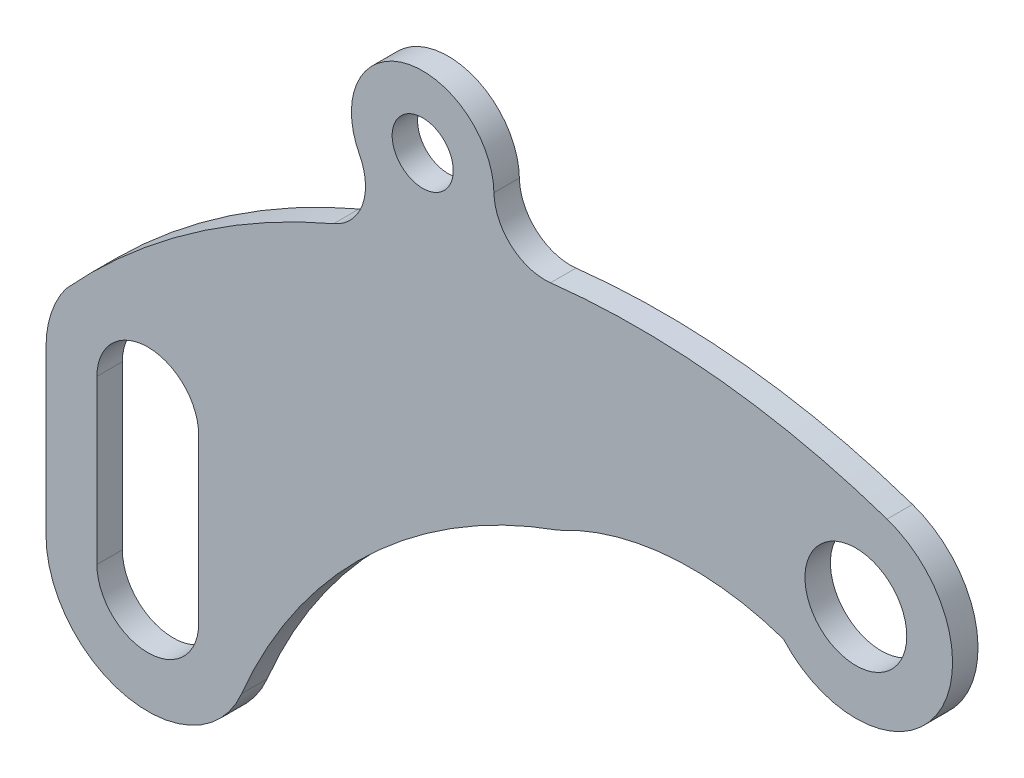
ISO-10303-21;
HEADER;
FILE_DESCRIPTION(('STEP AP214'),'2;1');
FILE_NAME('part.step','',(''),(''),'','','');
FILE_SCHEMA(('AUTOMOTIVE_DESIGN { 1 0 10303 214 1 1 1 1 }'));
ENDSEC;
DATA;
#1=APPLICATION_CONTEXT('core data for automotive mechanical design processes');
#2=APPLICATION_PROTOCOL_DEFINITION('international standard','automotive_design',2000,#1);
#3=PRODUCT_CONTEXT('',#1,'mechanical');
#4=PRODUCT('Part','Part','',(#3));
#5=PRODUCT_RELATED_PRODUCT_CATEGORY('part','',(#4));
#6=PRODUCT_DEFINITION_FORMATION('','',#4);
#7=PRODUCT_DEFINITION_CONTEXT('part definition',#1,'design');
#8=PRODUCT_DEFINITION('design','',#6,#7);
#9=PRODUCT_DEFINITION_SHAPE('','',#8);
#10=(LENGTH_UNIT() NAMED_UNIT(*) SI_UNIT(.MILLI.,.METRE.));
#11=(NAMED_UNIT(*) PLANE_ANGLE_UNIT() SI_UNIT($,.RADIAN.));
#12=(NAMED_UNIT(*) SI_UNIT($,.STERADIAN.) SOLID_ANGLE_UNIT());
#13=UNCERTAINTY_MEASURE_WITH_UNIT(LENGTH_MEASURE(1.E-05),#10,'distance_accuracy_value','');
#14=(GEOMETRIC_REPRESENTATION_CONTEXT(3) GLOBAL_UNCERTAINTY_ASSIGNED_CONTEXT((#13)) GLOBAL_UNIT_ASSIGNED_CONTEXT((#10,
#11,#12)) REPRESENTATION_CONTEXT('',''));
#15=CARTESIAN_POINT('',(0.,0.,0.));
#16=DIRECTION('',(0.,0.,1.));
#17=DIRECTION('',(1.,0.,0.));
#18=AXIS2_PLACEMENT_3D('',#15,#16,#17);
#19=CARTESIAN_POINT('',(0.,0.,5.));
#20=DIRECTION('',(0.,0.,-1.));
#21=DIRECTION('',(-1.,0.,0.));
#22=AXIS2_PLACEMENT_3D('',#19,#20,#21);
#23=CYLINDRICAL_SURFACE('',#22,6.);
#24=CARTESIAN_POINT('',(0.,0.,5.));
#25=DIRECTION('',(0.,0.,1.));
#26=DIRECTION('',(1.,0.,0.));
#27=AXIS2_PLACEMENT_3D('',#24,#25,#26);
#28=CIRCLE('',#27,6.);
#29=CARTESIAN_POINT('',(6.,0.,5.));
#30=VERTEX_POINT('',#29);
#31=EDGE_CURVE('E247',#30,#30,#28,.T.);
#32=ORIENTED_EDGE('',*,*,#31,.T.);
#33=EDGE_LOOP('',(#32));
#34=FACE_BOUND('',#33,.T.);
#35=CARTESIAN_POINT('',(0.,0.,0.));
#36=DIRECTION('',(0.,0.,1.));
#37=DIRECTION('',(1.,0.,0.));
#38=AXIS2_PLACEMENT_3D('',#35,#36,#37);
#39=CIRCLE('',#38,6.);
#40=CARTESIAN_POINT('',(6.,0.,0.));
#41=VERTEX_POINT('',#40);
#42=EDGE_CURVE('E290',#41,#41,#39,.T.);
#43=ORIENTED_EDGE('',*,*,#42,.F.);
#44=EDGE_LOOP('',(#43));
#45=FACE_BOUND('',#44,.T.);
#46=ADVANCED_FACE('F111',(#34,#45),#23,.F.);
#47=CARTESIAN_POINT('',(-44.,0.,5.));
#48=DIRECTION('',(1.,0.,0.));
#49=DIRECTION('',(0.,0.,-1.));
#50=AXIS2_PLACEMENT_3D('',#47,#48,#49);
#51=PLANE('',#50);
#52=DIRECTION('',(0.,-1.,0.));
#53=VECTOR('',#52,1.);
#54=CARTESIAN_POINT('',(-44.,0.,0.));
#55=LINE('',#54,#53);
#56=CARTESIAN_POINT('',(-44.,-70.,0.));
#57=VERTEX_POINT('',#56);
#58=CARTESIAN_POINT('',(-44.,-102.,0.));
#59=VERTEX_POINT('',#58);
#60=EDGE_CURVE('E240',#57,#59,#55,.T.);
#61=ORIENTED_EDGE('',*,*,#60,.T.);
#62=DIRECTION('',(0.,0.,-1.));
#63=VECTOR('',#62,1.);
#64=CARTESIAN_POINT('',(-44.,-102.,5.));
#65=LINE('',#64,#63);
#66=CARTESIAN_POINT('',(-44.,-102.,5.));
#67=VERTEX_POINT('',#66);
#68=EDGE_CURVE('E121',#67,#59,#65,.T.);
#69=ORIENTED_EDGE('',*,*,#68,.F.);
#70=DIRECTION('',(0.,-1.,0.));
#71=VECTOR('',#70,1.);
#72=CARTESIAN_POINT('',(-44.,0.,5.));
#73=LINE('',#72,#71);
#74=CARTESIAN_POINT('',(-44.,-70.,5.));
#75=VERTEX_POINT('',#74);
#76=EDGE_CURVE('E227',#75,#67,#73,.T.);
#77=ORIENTED_EDGE('',*,*,#76,.F.);
#78=DIRECTION('',(0.,0.,-1.));
#79=VECTOR('',#78,1.);
#80=CARTESIAN_POINT('',(-44.,-70.,5.));
#81=LINE('',#80,#79);
#82=EDGE_CURVE('E12',#75,#57,#81,.T.);
#83=ORIENTED_EDGE('',*,*,#82,.T.);
#84=EDGE_LOOP('',(#61,#69,#77,#83));
#85=FACE_BOUND('',#84,.T.);
#86=ADVANCED_FACE('F238',(#85),#51,.F.);
#87=CARTESIAN_POINT('',(-54.,-102.,5.));
#88=DIRECTION('',(0.,0.,-1.));
#89=DIRECTION('',(-1.,0.,0.));
#90=AXIS2_PLACEMENT_3D('',#87,#88,#89);
#91=CYLINDRICAL_SURFACE('',#90,10.);
#92=CARTESIAN_POINT('',(-54.,-102.,0.));
#93=DIRECTION('',(0.,0.,1.));
#94=DIRECTION('',(1.,0.,0.));
#95=AXIS2_PLACEMENT_3D('',#92,#93,#94);
#96=CIRCLE('',#95,10.);
#97=CARTESIAN_POINT('',(-64.,-102.,0.));
#98=VERTEX_POINT('',#97);
#99=EDGE_CURVE('E285',#98,#59,#96,.T.);
#100=ORIENTED_EDGE('',*,*,#99,.F.);
#101=DIRECTION('',(0.,0.,-1.));
#102=VECTOR('',#101,1.);
#103=CARTESIAN_POINT('',(-64.,-102.,5.));
#104=LINE('',#103,#102);
#105=CARTESIAN_POINT('',(-64.,-102.,5.));
#106=VERTEX_POINT('',#105);
#107=EDGE_CURVE('E176',#106,#98,#104,.T.);
#108=ORIENTED_EDGE('',*,*,#107,.F.);
#109=CARTESIAN_POINT('',(-54.,-102.,5.));
#110=DIRECTION('',(0.,0.,1.));
#111=DIRECTION('',(1.,0.,0.));
#112=AXIS2_PLACEMENT_3D('',#109,#110,#111);
#113=CIRCLE('',#112,10.);
#114=EDGE_CURVE('E233',#106,#67,#113,.T.);
#115=ORIENTED_EDGE('',*,*,#114,.T.);
#116=ORIENTED_EDGE('',*,*,#68,.T.);
#117=EDGE_LOOP('',(#100,#108,#115,#116));
#118=FACE_BOUND('',#117,.T.);
#119=ADVANCED_FACE('F244',(#118),#91,.F.);
#120=CARTESIAN_POINT('',(-64.,0.,5.));
#121=DIRECTION('',(1.,0.,0.));
#122=DIRECTION('',(0.,0.,-1.));
#123=AXIS2_PLACEMENT_3D('',#120,#121,#122);
#124=PLANE('',#123);
#125=DIRECTION('',(0.,-1.,0.));
#126=VECTOR('',#125,1.);
#127=CARTESIAN_POINT('',(-64.,0.,0.));
#128=LINE('',#127,#126);
#129=CARTESIAN_POINT('',(-64.,-70.,0.));
#130=VERTEX_POINT('',#129);
#131=EDGE_CURVE('E287',#130,#98,#128,.T.);
#132=ORIENTED_EDGE('',*,*,#131,.F.);
#133=DIRECTION('',(0.,0.,-1.));
#134=VECTOR('',#133,1.);
#135=CARTESIAN_POINT('',(-64.,-70.,5.));
#136=LINE('',#135,#134);
#137=CARTESIAN_POINT('',(-64.,-70.,5.));
#138=VERTEX_POINT('',#137);
#139=EDGE_CURVE('E130',#138,#130,#136,.T.);
#140=ORIENTED_EDGE('',*,*,#139,.F.);
#141=DIRECTION('',(0.,-1.,0.));
#142=VECTOR('',#141,1.);
#143=CARTESIAN_POINT('',(-64.,0.,5.));
#144=LINE('',#143,#142);
#145=EDGE_CURVE('E245',#138,#106,#144,.T.);
#146=ORIENTED_EDGE('',*,*,#145,.T.);
#147=ORIENTED_EDGE('',*,*,#107,.T.);
#148=EDGE_LOOP('',(#132,#140,#146,#147));
#149=FACE_BOUND('',#148,.T.);
#150=ADVANCED_FACE('F356',(#149),#124,.T.);
#151=CARTESIAN_POINT('',(-54.,-70.,5.));
#152=DIRECTION('',(0.,0.,-1.));
#153=DIRECTION('',(-1.,0.,0.));
#154=AXIS2_PLACEMENT_3D('',#151,#152,#153);
#155=CYLINDRICAL_SURFACE('',#154,10.);
#156=CARTESIAN_POINT('',(-54.,-70.,0.));
#157=DIRECTION('',(0.,0.,1.));
#158=DIRECTION('',(1.,0.,0.));
#159=AXIS2_PLACEMENT_3D('',#156,#157,#158);
#160=CIRCLE('',#159,10.);
#161=EDGE_CURVE('E282',#57,#130,#160,.T.);
#162=ORIENTED_EDGE('',*,*,#161,.F.);
#163=ORIENTED_EDGE('',*,*,#82,.F.);
#164=CARTESIAN_POINT('',(-54.,-70.,5.));
#165=DIRECTION('',(0.,0.,1.));
#166=DIRECTION('',(1.,0.,0.));
#167=AXIS2_PLACEMENT_3D('',#164,#165,#166);
#168=CIRCLE('',#167,10.);
#169=EDGE_CURVE('E234',#75,#138,#168,.T.);
#170=ORIENTED_EDGE('',*,*,#169,.T.);
#171=ORIENTED_EDGE('',*,*,#139,.T.);
#172=EDGE_LOOP('',(#162,#163,#170,#171));
#173=FACE_BOUND('',#172,.T.);
#174=ADVANCED_FACE('F355',(#173),#155,.F.);
#175=CARTESIAN_POINT('',(42.2136389661838,-160.542856226095,5.));
#176=DIRECTION('',(0.,0.,-1.));
#177=DIRECTION('',(-1.,0.,0.));
#178=AXIS2_PLACEMENT_3D('',#175,#176,#177);
#179=CYLINDRICAL_SURFACE('',#178,152.);
#180=CARTESIAN_POINT('',(42.2136389661838,-160.542856226095,0.));
#181=DIRECTION('',(0.,0.,1.));
#182=DIRECTION('',(1.,0.,0.));
#183=AXIS2_PLACEMENT_3D('',#180,#181,#182);
#184=CIRCLE('',#183,152.);
#185=CARTESIAN_POINT('',(-17.5051992724743,-20.7656751147816,0.));
#186=VERTEX_POINT('',#185);
#187=CARTESIAN_POINT('',(-70.0584659357142,-58.0783528071198,0.));
#188=VERTEX_POINT('',#187);
#189=EDGE_CURVE('E257',#186,#188,#184,.T.);
#190=ORIENTED_EDGE('',*,*,#189,.T.);
#191=DIRECTION('',(0.,0.,-1.));
#192=VECTOR('',#191,1.);
#193=CARTESIAN_POINT('',(-70.0584659357142,-58.0783528071198,5.));
#194=LINE('',#193,#192);
#195=CARTESIAN_POINT('',(-70.0584659357142,-58.0783528071198,5.));
#196=VERTEX_POINT('',#195);
#197=EDGE_CURVE('E315',#196,#188,#194,.T.);
#198=ORIENTED_EDGE('',*,*,#197,.F.);
#199=CARTESIAN_POINT('',(42.2136389661838,-160.542856226095,5.));
#200=DIRECTION('',(0.,0.,1.));
#201=DIRECTION('',(1.,0.,0.));
#202=AXIS2_PLACEMENT_3D('',#199,#200,#201);
#203=CIRCLE('',#202,152.);
#204=CARTESIAN_POINT('',(-17.5051992724743,-20.7656751147816,5.));
#205=VERTEX_POINT('',#204);
#206=EDGE_CURVE('E551',#205,#196,#203,.T.);
#207=ORIENTED_EDGE('',*,*,#206,.F.);
#208=DIRECTION('',(0.,0.,-1.));
#209=VECTOR('',#208,1.);
#210=CARTESIAN_POINT('',(-17.5051992724743,-20.7656751147816,5.));
#211=LINE('',#210,#209);
#212=EDGE_CURVE('E188',#205,#186,#211,.T.);
#213=ORIENTED_EDGE('',*,*,#212,.T.);
#214=EDGE_LOOP('',(#190,#198,#207,#213));
#215=FACE_BOUND('',#214,.T.);
#216=ADVANCED_FACE('F363',(#215),#179,.T.);
#217=CARTESIAN_POINT('',(-54.,-70.,5.));
#218=DIRECTION('',(0.,0.,-1.));
#219=DIRECTION('',(-1.,0.,0.));
#220=AXIS2_PLACEMENT_3D('',#217,#218,#219);
#221=CYLINDRICAL_SURFACE('',#220,20.);
#222=CARTESIAN_POINT('',(-54.,-70.,0.));
#223=DIRECTION('',(0.,0.,1.));
#224=DIRECTION('',(1.,0.,0.));
#225=AXIS2_PLACEMENT_3D('',#222,#223,#224);
#226=CIRCLE('',#225,20.);
#227=CARTESIAN_POINT('',(-74.,-70.,0.));
#228=VERTEX_POINT('',#227);
#229=EDGE_CURVE('E260',#188,#228,#226,.T.);
#230=ORIENTED_EDGE('',*,*,#229,.T.);
#231=DIRECTION('',(0.,0.,-1.));
#232=VECTOR('',#231,1.);
#233=CARTESIAN_POINT('',(-74.,-70.,5.));
#234=LINE('',#233,#232);
#235=CARTESIAN_POINT('',(-74.,-70.,5.));
#236=VERTEX_POINT('',#235);
#237=EDGE_CURVE('E312',#236,#228,#234,.T.);
#238=ORIENTED_EDGE('',*,*,#237,.F.);
#239=CARTESIAN_POINT('',(-54.,-70.,5.));
#240=DIRECTION('',(0.,0.,1.));
#241=DIRECTION('',(1.,0.,0.));
#242=AXIS2_PLACEMENT_3D('',#239,#240,#241);
#243=CIRCLE('',#242,20.);
#244=EDGE_CURVE('E536',#196,#236,#243,.T.);
#245=ORIENTED_EDGE('',*,*,#244,.F.);
#246=ORIENTED_EDGE('',*,*,#197,.T.);
#247=EDGE_LOOP('',(#230,#238,#245,#246));
#248=FACE_BOUND('',#247,.T.);
#249=ADVANCED_FACE('F482',(#248),#221,.T.);
#250=CARTESIAN_POINT('',(-74.,0.,5.));
#251=DIRECTION('',(1.,0.,0.));
#252=DIRECTION('',(0.,0.,-1.));
#253=AXIS2_PLACEMENT_3D('',#250,#251,#252);
#254=PLANE('',#253);
#255=DIRECTION('',(0.,-1.,0.));
#256=VECTOR('',#255,1.);
#257=CARTESIAN_POINT('',(-74.,0.,0.));
#258=LINE('',#257,#256);
#259=CARTESIAN_POINT('',(-74.,-102.,0.));
#260=VERTEX_POINT('',#259);
#261=EDGE_CURVE('E262',#228,#260,#258,.T.);
#262=ORIENTED_EDGE('',*,*,#261,.T.);
#263=DIRECTION('',(0.,0.,-1.));
#264=VECTOR('',#263,1.);
#265=CARTESIAN_POINT('',(-74.,-102.,5.));
#266=LINE('',#265,#264);
#267=CARTESIAN_POINT('',(-74.,-102.,5.));
#268=VERTEX_POINT('',#267);
#269=EDGE_CURVE('E309',#268,#260,#266,.T.);
#270=ORIENTED_EDGE('',*,*,#269,.F.);
#271=DIRECTION('',(0.,-1.,0.));
#272=VECTOR('',#271,1.);
#273=CARTESIAN_POINT('',(-74.,0.,5.));
#274=LINE('',#273,#272);
#275=EDGE_CURVE('E546',#236,#268,#274,.T.);
#276=ORIENTED_EDGE('',*,*,#275,.F.);
#277=ORIENTED_EDGE('',*,*,#237,.T.);
#278=EDGE_LOOP('',(#262,#270,#276,#277));
#279=FACE_BOUND('',#278,.T.);
#280=ADVANCED_FACE('F472',(#279),#254,.F.);
#281=CARTESIAN_POINT('',(-54.,-102.,5.));
#282=DIRECTION('',(0.,0.,-1.));
#283=DIRECTION('',(-1.,0.,0.));
#284=AXIS2_PLACEMENT_3D('',#281,#282,#283);
#285=CYLINDRICAL_SURFACE('',#284,20.);
#286=CARTESIAN_POINT('',(-54.,-102.,0.));
#287=DIRECTION('',(0.,0.,1.));
#288=DIRECTION('',(1.,0.,0.));
#289=AXIS2_PLACEMENT_3D('',#286,#287,#288);
#290=CIRCLE('',#289,20.);
#291=CARTESIAN_POINT('',(-35.5543777539648,-109.73039584734,0.));
#292=VERTEX_POINT('',#291);
#293=EDGE_CURVE('E264',#260,#292,#290,.T.);
#294=ORIENTED_EDGE('',*,*,#293,.T.);
#295=DIRECTION('',(0.,0.,-1.));
#296=VECTOR('',#295,1.);
#297=CARTESIAN_POINT('',(-35.5543777539648,-109.73039584734,5.));
#298=LINE('',#297,#296);
#299=CARTESIAN_POINT('',(-35.5543777539648,-109.73039584734,5.));
#300=VERTEX_POINT('',#299);
#301=EDGE_CURVE('E307',#300,#292,#298,.T.);
#302=ORIENTED_EDGE('',*,*,#301,.F.);
#303=CARTESIAN_POINT('',(-54.,-102.,5.));
#304=DIRECTION('',(0.,0.,1.));
#305=DIRECTION('',(1.,0.,0.));
#306=AXIS2_PLACEMENT_3D('',#303,#304,#305);
#307=CIRCLE('',#306,20.);
#308=EDGE_CURVE('E543',#268,#300,#307,.T.);
#309=ORIENTED_EDGE('',*,*,#308,.F.);
#310=ORIENTED_EDGE('',*,*,#269,.T.);
#311=EDGE_LOOP('',(#294,#302,#309,#310));
#312=FACE_BOUND('',#311,.T.);
#313=ADVANCED_FACE('F462',(#312),#285,.T.);
#314=CARTESIAN_POINT('',(62.2074201500216,-150.701493838242,5.));
#315=DIRECTION('',(0.,0.,-1.));
#316=DIRECTION('',(-1.,0.,0.));
#317=AXIS2_PLACEMENT_3D('',#314,#315,#316);
#318=CYLINDRICAL_SURFACE('',#317,106.);
#319=CARTESIAN_POINT('',(62.2074201500216,-150.701493838242,0.));
#320=DIRECTION('',(0.,0.,1.));
#321=DIRECTION('',(1.,0.,0.));
#322=AXIS2_PLACEMENT_3D('',#319,#320,#321);
#323=CIRCLE('',#322,106.);
#324=CARTESIAN_POINT('',(26.6493751879772,-50.8434674283577,0.));
#325=VERTEX_POINT('',#324);
#326=EDGE_CURVE('E267',#325,#292,#323,.T.);
#327=ORIENTED_EDGE('',*,*,#326,.F.);
#328=DIRECTION('',(0.,0.,-1.));
#329=VECTOR('',#328,1.);
#330=CARTESIAN_POINT('',(26.6493751879772,-50.8434674283577,5.));
#331=LINE('',#330,#329);
#332=CARTESIAN_POINT('',(26.6493751879772,-50.8434674283577,5.));
#333=VERTEX_POINT('',#332);
#334=EDGE_CURVE('E305',#333,#325,#331,.T.);
#335=ORIENTED_EDGE('',*,*,#334,.F.);
#336=CARTESIAN_POINT('',(62.2074201500216,-150.701493838242,5.));
#337=DIRECTION('',(0.,0.,1.));
#338=DIRECTION('',(1.,0.,0.));
#339=AXIS2_PLACEMENT_3D('',#336,#337,#338);
#340=CIRCLE('',#339,106.);
#341=EDGE_CURVE('E351',#333,#300,#340,.T.);
#342=ORIENTED_EDGE('',*,*,#341,.T.);
#343=ORIENTED_EDGE('',*,*,#301,.T.);
#344=EDGE_LOOP('',(#327,#335,#342,#343));
#345=FACE_BOUND('',#344,.T.);
#346=ADVANCED_FACE('F452',(#345),#318,.F.);
#347=CARTESIAN_POINT('',(52.8782067324443,-99.5892475456725,5.));
#348=DIRECTION('',(0.,0.,-1.));
#349=DIRECTION('',(-1.,0.,0.));
#350=AXIS2_PLACEMENT_3D('',#347,#348,#349);
#351=CYLINDRICAL_SURFACE('',#350,55.3543375304378);
#352=CARTESIAN_POINT('',(52.8782067324443,-99.5892475456725,0.));
#353=DIRECTION('',(0.,0.,1.));
#354=DIRECTION('',(1.,0.,0.));
#355=AXIS2_PLACEMENT_3D('',#352,#353,#354);
#356=CIRCLE('',#355,55.3543375304378);
#357=CARTESIAN_POINT('',(70.8728830515349,-47.241427079059,0.));
#358=VERTEX_POINT('',#357);
#359=EDGE_CURVE('E270',#358,#325,#356,.T.);
#360=ORIENTED_EDGE('',*,*,#359,.F.);
#361=DIRECTION('',(0.,0.,-1.));
#362=VECTOR('',#361,1.);
#363=CARTESIAN_POINT('',(70.8728830515349,-47.241427079059,5.));
#364=LINE('',#363,#362);
#365=CARTESIAN_POINT('',(70.8728830515349,-47.241427079059,5.));
#366=VERTEX_POINT('',#365);
#367=EDGE_CURVE('E303',#366,#358,#364,.T.);
#368=ORIENTED_EDGE('',*,*,#367,.F.);
#369=CARTESIAN_POINT('',(52.8782067324443,-99.5892475456725,5.));
#370=DIRECTION('',(0.,0.,1.));
#371=DIRECTION('',(1.,0.,0.));
#372=AXIS2_PLACEMENT_3D('',#369,#370,#371);
#373=CIRCLE('',#372,55.3543375304378);
#374=EDGE_CURVE('E346',#366,#333,#373,.T.);
#375=ORIENTED_EDGE('',*,*,#374,.T.);
#376=ORIENTED_EDGE('',*,*,#334,.T.);
#377=EDGE_LOOP('',(#360,#368,#375,#376));
#378=FACE_BOUND('',#377,.T.);
#379=ADVANCED_FACE('F443',(#378),#351,.F.);
#380=CARTESIAN_POINT('',(42.2136389661838,-160.542856226095,5.));
#381=DIRECTION('',(0.,0.,-1.));
#382=DIRECTION('',(-1.,0.,0.));
#383=AXIS2_PLACEMENT_3D('',#380,#381,#382);
#384=CYLINDRICAL_SURFACE('',#383,152.);
#385=CARTESIAN_POINT('',(42.2136389661838,-160.542856226095,0.));
#386=DIRECTION('',(0.,0.,1.));
#387=DIRECTION('',(1.,0.,0.));
#388=AXIS2_PLACEMENT_3D('',#385,#386,#387);
#389=CIRCLE('',#388,152.);
#390=CARTESIAN_POINT('',(91.2249096484811,-16.661323894435,0.));
#391=VERTEX_POINT('',#390);
#392=CARTESIAN_POINT('',(25.1206912703911,-9.50699578537441,0.));
#393=VERTEX_POINT('',#392);
#394=EDGE_CURVE('E273',#391,#393,#389,.T.);
#395=ORIENTED_EDGE('',*,*,#394,.T.);
#396=DIRECTION('',(0.,0.,-1.));
#397=VECTOR('',#396,1.);
#398=CARTESIAN_POINT('',(25.1206912703911,-9.50699578537441,5.));
#399=LINE('',#398,#397);
#400=CARTESIAN_POINT('',(25.1206912703911,-9.50699578537441,5.));
#401=VERTEX_POINT('',#400);
#402=EDGE_CURVE('E299',#401,#393,#399,.T.);
#403=ORIENTED_EDGE('',*,*,#402,.F.);
#404=CARTESIAN_POINT('',(42.2136389661838,-160.542856226095,5.));
#405=DIRECTION('',(0.,0.,1.));
#406=DIRECTION('',(1.,0.,0.));
#407=AXIS2_PLACEMENT_3D('',#404,#405,#406);
#408=CIRCLE('',#407,152.);
#409=CARTESIAN_POINT('',(91.2249096484811,-16.661323894435,5.));
#410=VERTEX_POINT('',#409);
#411=EDGE_CURVE('E343',#410,#401,#408,.T.);
#412=ORIENTED_EDGE('',*,*,#411,.F.);
#413=DIRECTION('',(0.,0.,-1.));
#414=VECTOR('',#413,1.);
#415=CARTESIAN_POINT('',(91.2249096484811,-16.661323894435,5.));
#416=LINE('',#415,#414);
#417=EDGE_CURVE('E301',#410,#391,#416,.T.);
#418=ORIENTED_EDGE('',*,*,#417,.T.);
#419=EDGE_LOOP('',(#395,#403,#412,#418));
#420=FACE_BOUND('',#419,.T.);
#421=ADVANCED_FACE('F341',(#420),#384,.T.);
#422=CARTESIAN_POINT('',(23.9961552377732,0.429573980462476,5.));
#423=DIRECTION('',(0.,0.,-1.));
#424=DIRECTION('',(-1.,0.,0.));
#425=AXIS2_PLACEMENT_3D('',#422,#423,#424);
#426=CYLINDRICAL_SURFACE('',#425,9.99999999999999);
#427=CARTESIAN_POINT('',(23.9961552377732,0.429573980462476,0.));
#428=DIRECTION('',(0.,0.,1.));
#429=DIRECTION('',(1.,0.,0.));
#430=AXIS2_PLACEMENT_3D('',#427,#428,#429);
#431=CIRCLE('',#430,9.99999999999999);
#432=CARTESIAN_POINT('',(13.9977572220344,0.250584821936449,0.));
#433=VERTEX_POINT('',#432);
#434=EDGE_CURVE('E276',#433,#393,#431,.T.);
#435=ORIENTED_EDGE('',*,*,#434,.F.);
#436=DIRECTION('',(0.,0.,-1.));
#437=VECTOR('',#436,1.);
#438=CARTESIAN_POINT('',(13.9977572220344,0.250584821936449,5.));
#439=LINE('',#438,#437);
#440=CARTESIAN_POINT('',(13.9977572220344,0.250584821936449,5.));
#441=VERTEX_POINT('',#440);
#442=EDGE_CURVE('E297',#441,#433,#439,.T.);
#443=ORIENTED_EDGE('',*,*,#442,.F.);
#444=CARTESIAN_POINT('',(23.9961552377732,0.429573980462476,5.));
#445=DIRECTION('',(0.,0.,1.));
#446=DIRECTION('',(1.,0.,0.));
#447=AXIS2_PLACEMENT_3D('',#444,#445,#446);
#448=CIRCLE('',#447,9.99999999999999);
#449=EDGE_CURVE('E345',#441,#401,#448,.T.);
#450=ORIENTED_EDGE('',*,*,#449,.T.);
#451=ORIENTED_EDGE('',*,*,#402,.T.);
#452=EDGE_LOOP('',(#435,#443,#450,#451));
#453=FACE_BOUND('',#452,.T.);
#454=ADVANCED_FACE('F424',(#453),#426,.F.);
#455=CARTESIAN_POINT('',(0.,0.,5.));
#456=DIRECTION('',(0.,0.,-1.));
#457=DIRECTION('',(-1.,0.,0.));
#458=AXIS2_PLACEMENT_3D('',#455,#456,#457);
#459=CYLINDRICAL_SURFACE('',#458,14.);
#460=CARTESIAN_POINT('',(0.,0.,0.));
#461=DIRECTION('',(0.,0.,1.));
#462=DIRECTION('',(1.,0.,0.));
#463=AXIS2_PLACEMENT_3D('',#460,#461,#462);
#464=CIRCLE('',#463,14.);
#465=CARTESIAN_POINT('',(-12.4083565317862,-6.48326215574225,0.));
#466=VERTEX_POINT('',#465);
#467=EDGE_CURVE('E279',#433,#466,#464,.T.);
#468=ORIENTED_EDGE('',*,*,#467,.T.);
#469=DIRECTION('',(0.,0.,-1.));
#470=VECTOR('',#469,1.);
#471=CARTESIAN_POINT('',(-12.4083565317862,-6.48326215574225,5.));
#472=LINE('',#471,#470);
#473=CARTESIAN_POINT('',(-12.4083565317862,-6.48326215574225,5.));
#474=VERTEX_POINT('',#473);
#475=EDGE_CURVE('E253',#474,#466,#472,.T.);
#476=ORIENTED_EDGE('',*,*,#475,.F.);
#477=CARTESIAN_POINT('',(0.,0.,5.));
#478=DIRECTION('',(0.,0.,1.));
#479=DIRECTION('',(1.,0.,0.));
#480=AXIS2_PLACEMENT_3D('',#477,#478,#479);
#481=CIRCLE('',#480,14.);
#482=EDGE_CURVE('E348',#441,#474,#481,.T.);
#483=ORIENTED_EDGE('',*,*,#482,.F.);
#484=ORIENTED_EDGE('',*,*,#442,.T.);
#485=EDGE_LOOP('',(#468,#476,#483,#484));
#486=FACE_BOUND('',#485,.T.);
#487=ADVANCED_FACE('F414',(#486),#459,.T.);
#488=CARTESIAN_POINT('',(-21.5635413424951,-11.2667693881502,5.));
#489=DIRECTION('',(0.,0.,-1.));
#490=DIRECTION('',(-1.,0.,0.));
#491=AXIS2_PLACEMENT_3D('',#488,#489,#490);
#492=CYLINDRICAL_SURFACE('',#491,10.3295377612328);
#493=CARTESIAN_POINT('',(-21.5635413424951,-11.2667693881502,0.));
#494=DIRECTION('',(0.,0.,1.));
#495=DIRECTION('',(1.,0.,0.));
#496=AXIS2_PLACEMENT_3D('',#493,#494,#495);
#497=CIRCLE('',#496,10.3295377612328);
#498=EDGE_CURVE('E254',#186,#466,#497,.T.);
#499=ORIENTED_EDGE('',*,*,#498,.F.);
#500=ORIENTED_EDGE('',*,*,#212,.F.);
#501=CARTESIAN_POINT('',(-21.5635413424951,-11.2667693881502,5.));
#502=DIRECTION('',(0.,0.,1.));
#503=DIRECTION('',(1.,0.,0.));
#504=AXIS2_PLACEMENT_3D('',#501,#502,#503);
#505=CIRCLE('',#504,10.3295377612328);
#506=EDGE_CURVE('E293',#205,#474,#505,.T.);
#507=ORIENTED_EDGE('',*,*,#506,.T.);
#508=ORIENTED_EDGE('',*,*,#475,.T.);
#509=EDGE_LOOP('',(#499,#500,#507,#508));
#510=FACE_BOUND('',#509,.T.);
#511=ADVANCED_FACE('F377',(#510),#492,.F.);
#512=CARTESIAN_POINT('',(0.,0.,0.));
#513=DIRECTION('',(0.,0.,1.));
#514=DIRECTION('',(1.,0.,0.));
#515=AXIS2_PLACEMENT_3D('',#512,#513,#514);
#516=PLANE('',#515);
#517=ORIENTED_EDGE('',*,*,#498,.T.);
#518=ORIENTED_EDGE('',*,*,#467,.F.);
#519=ORIENTED_EDGE('',*,*,#434,.T.);
#520=ORIENTED_EDGE('',*,*,#394,.F.);
#521=CARTESIAN_POINT('',(85.0985008131939,-34.6465154358925,0.));
#522=DIRECTION('',(0.,0.,1.));
#523=DIRECTION('',(1.,0.,0.));
#524=AXIS2_PLACEMENT_3D('',#521,#522,#523);
#525=CIRCLE('',#524,19.);
#526=EDGE_CURVE('E115',#358,#391,#525,.T.);
#527=ORIENTED_EDGE('',*,*,#526,.F.);
#528=ORIENTED_EDGE('',*,*,#359,.T.);
#529=ORIENTED_EDGE('',*,*,#326,.T.);
#530=ORIENTED_EDGE('',*,*,#293,.F.);
#531=ORIENTED_EDGE('',*,*,#261,.F.);
#532=ORIENTED_EDGE('',*,*,#229,.F.);
#533=ORIENTED_EDGE('',*,*,#189,.F.);
#534=EDGE_LOOP('',(#517,#518,#519,#520,#527,#528,#529,#530,#531,#532,#533));
#535=FACE_BOUND('',#534,.T.);
#536=ORIENTED_EDGE('',*,*,#161,.T.);
#537=ORIENTED_EDGE('',*,*,#131,.T.);
#538=ORIENTED_EDGE('',*,*,#99,.T.);
#539=ORIENTED_EDGE('',*,*,#60,.F.);
#540=EDGE_LOOP('',(#536,#537,#538,#539));
#541=FACE_BOUND('',#540,.T.);
#542=ORIENTED_EDGE('',*,*,#42,.T.);
#543=EDGE_LOOP('',(#542));
#544=FACE_BOUND('',#543,.T.);
#545=CARTESIAN_POINT('',(85.0985008131939,-34.6465154358925,0.));
#546=DIRECTION('',(0.,0.,1.));
#547=DIRECTION('',(1.,0.,0.));
#548=AXIS2_PLACEMENT_3D('',#545,#546,#547);
#549=CIRCLE('',#548,9.99999999999999);
#550=CARTESIAN_POINT('',(95.0985008131939,-34.6465154358925,0.));
#551=VERTEX_POINT('',#550);
#552=EDGE_CURVE('E322',#551,#551,#549,.T.);
#553=ORIENTED_EDGE('',*,*,#552,.T.);
#554=EDGE_LOOP('',(#553));
#555=FACE_BOUND('',#554,.T.);
#556=ADVANCED_FACE('F335',(#535,#541,#544,#555),#516,.F.);
#557=CARTESIAN_POINT('',(0.,0.,5.));
#558=DIRECTION('',(0.,0.,1.));
#559=DIRECTION('',(1.,0.,0.));
#560=AXIS2_PLACEMENT_3D('',#557,#558,#559);
#561=PLANE('',#560);
#562=ORIENTED_EDGE('',*,*,#506,.F.);
#563=ORIENTED_EDGE('',*,*,#206,.T.);
#564=ORIENTED_EDGE('',*,*,#244,.T.);
#565=ORIENTED_EDGE('',*,*,#275,.T.);
#566=ORIENTED_EDGE('',*,*,#308,.T.);
#567=ORIENTED_EDGE('',*,*,#341,.F.);
#568=ORIENTED_EDGE('',*,*,#374,.F.);
#569=CARTESIAN_POINT('',(85.0985008131939,-34.6465154358925,5.));
#570=DIRECTION('',(0.,0.,1.));
#571=DIRECTION('',(1.,0.,0.));
#572=AXIS2_PLACEMENT_3D('',#569,#570,#571);
#573=CIRCLE('',#572,19.);
#574=EDGE_CURVE('E258',#366,#410,#573,.T.);
#575=ORIENTED_EDGE('',*,*,#574,.T.);
#576=ORIENTED_EDGE('',*,*,#411,.T.);
#577=ORIENTED_EDGE('',*,*,#449,.F.);
#578=ORIENTED_EDGE('',*,*,#482,.T.);
#579=EDGE_LOOP('',(#562,#563,#564,#565,#566,#567,#568,#575,#576,#577,#578));
#580=FACE_BOUND('',#579,.T.);
#581=ORIENTED_EDGE('',*,*,#169,.F.);
#582=ORIENTED_EDGE('',*,*,#76,.T.);
#583=ORIENTED_EDGE('',*,*,#114,.F.);
#584=ORIENTED_EDGE('',*,*,#145,.F.);
#585=EDGE_LOOP('',(#581,#582,#583,#584));
#586=FACE_BOUND('',#585,.T.);
#587=ORIENTED_EDGE('',*,*,#31,.F.);
#588=EDGE_LOOP('',(#587));
#589=FACE_BOUND('',#588,.T.);
#590=CARTESIAN_POINT('',(85.0985008131939,-34.6465154358925,5.));
#591=DIRECTION('',(0.,0.,1.));
#592=DIRECTION('',(1.,0.,0.));
#593=AXIS2_PLACEMENT_3D('',#590,#591,#592);
#594=CIRCLE('',#593,9.99999999999999);
#595=CARTESIAN_POINT('',(95.0985008131939,-34.6465154358925,5.));
#596=VERTEX_POINT('',#595);
#597=EDGE_CURVE('E319',#596,#596,#594,.T.);
#598=ORIENTED_EDGE('',*,*,#597,.F.);
#599=EDGE_LOOP('',(#598));
#600=FACE_BOUND('',#599,.T.);
#601=ADVANCED_FACE('F229',(#580,#586,#589,#600),#561,.T.);
#602=CARTESIAN_POINT('',(85.0985008131939,-34.6465154358925,5.));
#603=DIRECTION('',(0.,0.,-1.));
#604=DIRECTION('',(-1.,0.,0.));
#605=AXIS2_PLACEMENT_3D('',#602,#603,#604);
#606=CYLINDRICAL_SURFACE('',#605,9.99999999999999);
#607=ORIENTED_EDGE('',*,*,#597,.T.);
#608=EDGE_LOOP('',(#607));
#609=FACE_BOUND('',#608,.T.);
#610=ORIENTED_EDGE('',*,*,#552,.F.);
#611=EDGE_LOOP('',(#610));
#612=FACE_BOUND('',#611,.T.);
#613=ADVANCED_FACE('F379',(#609,#612),#606,.F.);
#614=CARTESIAN_POINT('',(85.0985008131939,-34.6465154358925,5.));
#615=DIRECTION('',(0.,0.,-1.));
#616=DIRECTION('',(-1.,0.,0.));
#617=AXIS2_PLACEMENT_3D('',#614,#615,#616);
#618=CYLINDRICAL_SURFACE('',#617,19.);
#619=ORIENTED_EDGE('',*,*,#367,.T.);
#620=ORIENTED_EDGE('',*,*,#526,.T.);
#621=ORIENTED_EDGE('',*,*,#417,.F.);
#622=ORIENTED_EDGE('',*,*,#574,.F.);
#623=EDGE_LOOP('',(#619,#620,#621,#622));
#624=FACE_BOUND('',#623,.T.);
#625=ADVANCED_FACE('F113',(#624),#618,.T.);
#626=CLOSED_SHELL('',(#46,#86,#119,#150,#174,#216,#249,#280,#313,#346,#379,#421,#454,#487,#511,
#556,#601,#613,#625));
#627=MANIFOLD_SOLID_BREP('B2',#626);
#628=ADVANCED_BREP_SHAPE_REPRESENTATION('',(#18,#627),#14);
#629=SHAPE_DEFINITION_REPRESENTATION(#9,#628);
ENDSEC;
END-ISO-10303-21;
